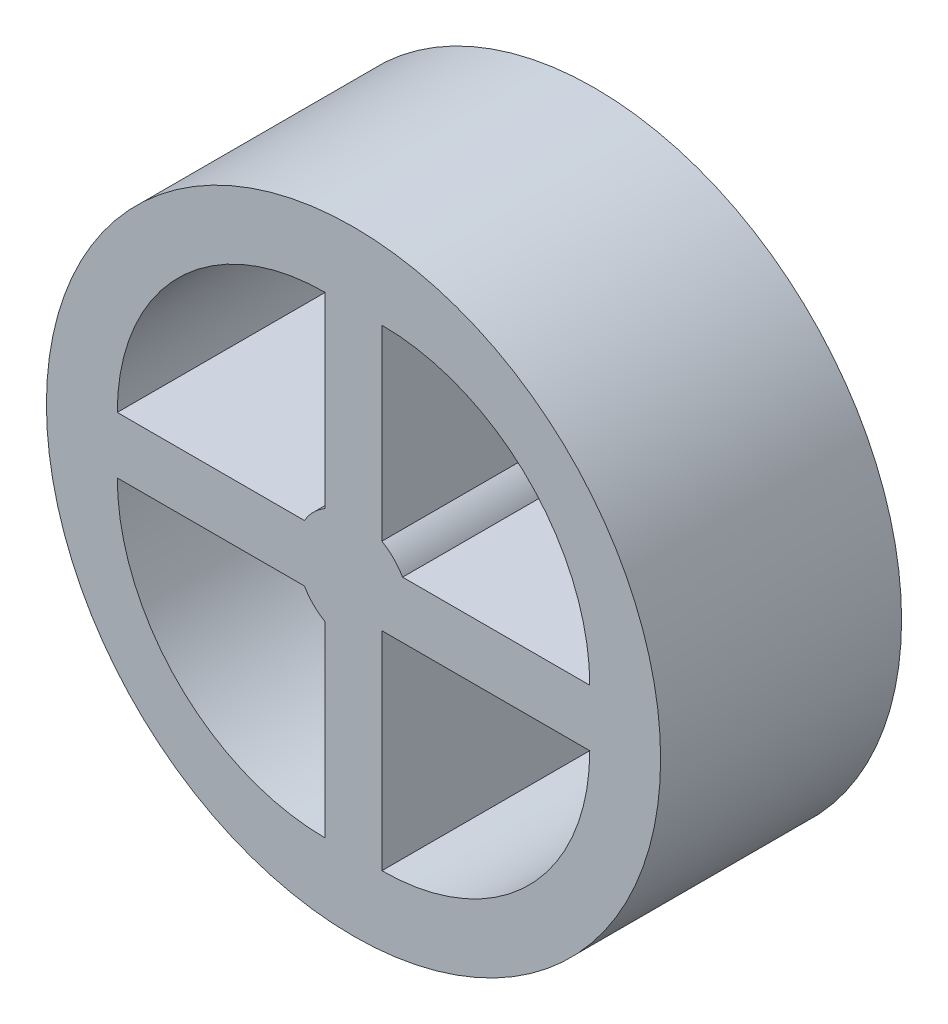
ISO-10303-21;
HEADER;
FILE_DESCRIPTION(('STEP AP214'),'2;1');
FILE_NAME('part.step','',(''),(''),'','','');
FILE_SCHEMA(('AUTOMOTIVE_DESIGN { 1 0 10303 214 1 1 1 1 }'));
ENDSEC;
DATA;
#1=APPLICATION_CONTEXT('core data for automotive mechanical design processes');
#2=APPLICATION_PROTOCOL_DEFINITION('international standard','automotive_design',2000,#1);
#3=PRODUCT_CONTEXT('',#1,'mechanical');
#4=PRODUCT('Part','Part','',(#3));
#5=PRODUCT_RELATED_PRODUCT_CATEGORY('part','',(#4));
#6=PRODUCT_DEFINITION_FORMATION('','',#4);
#7=PRODUCT_DEFINITION_CONTEXT('part definition',#1,'design');
#8=PRODUCT_DEFINITION('design','',#6,#7);
#9=PRODUCT_DEFINITION_SHAPE('','',#8);
#10=(LENGTH_UNIT() NAMED_UNIT(*) SI_UNIT(.MILLI.,.METRE.));
#11=(NAMED_UNIT(*) PLANE_ANGLE_UNIT() SI_UNIT($,.RADIAN.));
#12=(NAMED_UNIT(*) SI_UNIT($,.STERADIAN.) SOLID_ANGLE_UNIT());
#13=UNCERTAINTY_MEASURE_WITH_UNIT(LENGTH_MEASURE(1.E-05),#10,'distance_accuracy_value','');
#14=(GEOMETRIC_REPRESENTATION_CONTEXT(3) GLOBAL_UNCERTAINTY_ASSIGNED_CONTEXT((#13)) GLOBAL_UNIT_ASSIGNED_CONTEXT((#10,
#11,#12)) REPRESENTATION_CONTEXT('',''));
#15=CARTESIAN_POINT('',(0.,0.,0.));
#16=DIRECTION('',(0.,0.,1.));
#17=DIRECTION('',(1.,0.,0.));
#18=AXIS2_PLACEMENT_3D('',#15,#16,#17);
#19=CARTESIAN_POINT('',(0.,0.,255.));
#20=DIRECTION('',(0.,0.,1.));
#21=DIRECTION('',(1.,0.,0.));
#22=AXIS2_PLACEMENT_3D('',#19,#20,#21);
#23=PLANE('',#22);
#24=DIRECTION('',(0.,-1.,0.));
#25=VECTOR('',#24,1.);
#26=CARTESIAN_POINT('',(30.0000000000006,-30.0000000000006,255.));
#27=LINE('',#26,#25);
#28=CARTESIAN_POINT('',(30.0000000000006,-30.0000000000006,255.));
#29=VERTEX_POINT('',#28);
#30=CARTESIAN_POINT('',(30.,-250.,255.));
#31=VERTEX_POINT('',#30);
#32=EDGE_CURVE('E148',#29,#31,#27,.T.);
#33=ORIENTED_EDGE('',*,*,#32,.F.);
#34=DIRECTION('',(-1.,0.,0.));
#35=VECTOR('',#34,1.);
#36=CARTESIAN_POINT('',(30.0000000000006,-30.0000000000006,255.));
#37=LINE('',#36,#35);
#38=CARTESIAN_POINT('',(250.,-30.0000000000005,255.));
#39=VERTEX_POINT('',#38);
#40=EDGE_CURVE('E140',#39,#29,#37,.T.);
#41=ORIENTED_EDGE('',*,*,#40,.F.);
#42=CARTESIAN_POINT('',(30.0000000000006,-30.0000000000006,255.));
#43=DIRECTION('',(0.,0.,1.));
#44=DIRECTION('',(-1.,0.,0.));
#45=AXIS2_PLACEMENT_3D('',#42,#43,#44);
#46=CIRCLE('',#45,219.999999999999);
#47=EDGE_CURVE('E158',#31,#39,#46,.T.);
#48=ORIENTED_EDGE('',*,*,#47,.F.);
#49=EDGE_LOOP('',(#33,#41,#48));
#50=FACE_BOUND('',#49,.T.);
#51=CARTESIAN_POINT('',(0.,0.,255.));
#52=DIRECTION('',(0.,0.,1.));
#53=DIRECTION('',(1.,0.,0.));
#54=AXIS2_PLACEMENT_3D('',#51,#52,#53);
#55=CIRCLE('',#54,325.);
#56=CARTESIAN_POINT('',(325.,0.,255.));
#57=VERTEX_POINT('',#56);
#58=EDGE_CURVE('E11',#57,#57,#55,.T.);
#59=ORIENTED_EDGE('',*,*,#58,.T.);
#60=EDGE_LOOP('',(#59));
#61=FACE_BOUND('',#60,.T.);
#62=DIRECTION('',(0.,-1.,0.));
#63=VECTOR('',#62,1.);
#64=CARTESIAN_POINT('',(30.,250.,255.));
#65=LINE('',#64,#63);
#66=CARTESIAN_POINT('',(30.,250.,255.));
#67=VERTEX_POINT('',#66);
#68=CARTESIAN_POINT('',(30.,51.9615242270663,255.));
#69=VERTEX_POINT('',#68);
#70=EDGE_CURVE('E232',#67,#69,#65,.T.);
#71=ORIENTED_EDGE('',*,*,#70,.F.);
#72=CARTESIAN_POINT('',(30.,30.,255.));
#73=DIRECTION('',(0.,0.,1.));
#74=DIRECTION('',(-1.,0.,0.));
#75=AXIS2_PLACEMENT_3D('',#72,#73,#74);
#76=CIRCLE('',#75,220.);
#77=CARTESIAN_POINT('',(250.,30.,255.));
#78=VERTEX_POINT('',#77);
#79=EDGE_CURVE('E230',#78,#67,#76,.T.);
#80=ORIENTED_EDGE('',*,*,#79,.F.);
#81=DIRECTION('',(1.,0.,0.));
#82=VECTOR('',#81,1.);
#83=CARTESIAN_POINT('',(51.9615242270663,30.,255.));
#84=LINE('',#83,#82);
#85=CARTESIAN_POINT('',(51.9615242270663,30.,255.));
#86=VERTEX_POINT('',#85);
#87=EDGE_CURVE('E238',#86,#78,#84,.T.);
#88=ORIENTED_EDGE('',*,*,#87,.F.);
#89=CARTESIAN_POINT('',(0.,0.,255.));
#90=DIRECTION('',(0.,0.,-1.));
#91=DIRECTION('',(1.,0.,0.));
#92=AXIS2_PLACEMENT_3D('',#89,#90,#91);
#93=CIRCLE('',#92,60.);
#94=EDGE_CURVE('E235',#69,#86,#93,.T.);
#95=ORIENTED_EDGE('',*,*,#94,.F.);
#96=EDGE_LOOP('',(#71,#80,#88,#95));
#97=FACE_BOUND('',#96,.T.);
#98=DIRECTION('',(0.,1.,0.));
#99=VECTOR('',#98,1.);
#100=CARTESIAN_POINT('',(-30.,250.,255.));
#101=LINE('',#100,#99);
#102=CARTESIAN_POINT('',(-30.,51.9615242270663,255.));
#103=VERTEX_POINT('',#102);
#104=CARTESIAN_POINT('',(-30.,250.,255.));
#105=VERTEX_POINT('',#104);
#106=EDGE_CURVE('E201',#103,#105,#101,.T.);
#107=ORIENTED_EDGE('',*,*,#106,.F.);
#108=CARTESIAN_POINT('',(0.,0.,255.));
#109=DIRECTION('',(0.,0.,-1.));
#110=DIRECTION('',(1.,0.,0.));
#111=AXIS2_PLACEMENT_3D('',#108,#109,#110);
#112=CIRCLE('',#111,60.);
#113=CARTESIAN_POINT('',(-51.9615242270663,30.,255.));
#114=VERTEX_POINT('',#113);
#115=EDGE_CURVE('E199',#114,#103,#112,.T.);
#116=ORIENTED_EDGE('',*,*,#115,.F.);
#117=DIRECTION('',(1.,0.,0.));
#118=VECTOR('',#117,1.);
#119=CARTESIAN_POINT('',(-51.9615242270663,30.,255.));
#120=LINE('',#119,#118);
#121=CARTESIAN_POINT('',(-250.,30.,255.));
#122=VERTEX_POINT('',#121);
#123=EDGE_CURVE('E207',#122,#114,#120,.T.);
#124=ORIENTED_EDGE('',*,*,#123,.F.);
#125=CARTESIAN_POINT('',(-30.,30.,255.));
#126=DIRECTION('',(0.,0.,1.));
#127=DIRECTION('',(1.,0.,0.));
#128=AXIS2_PLACEMENT_3D('',#125,#126,#127);
#129=CIRCLE('',#128,220.);
#130=EDGE_CURVE('E204',#105,#122,#129,.T.);
#131=ORIENTED_EDGE('',*,*,#130,.F.);
#132=EDGE_LOOP('',(#107,#116,#124,#131));
#133=FACE_BOUND('',#132,.T.);
#134=DIRECTION('',(0.,1.,0.));
#135=VECTOR('',#134,1.);
#136=CARTESIAN_POINT('',(-30.,-51.9615242270663,255.));
#137=LINE('',#136,#135);
#138=CARTESIAN_POINT('',(-30.,-250.,255.));
#139=VERTEX_POINT('',#138);
#140=CARTESIAN_POINT('',(-30.,-51.9615242270663,255.));
#141=VERTEX_POINT('',#140);
#142=EDGE_CURVE('E170',#139,#141,#137,.T.);
#143=ORIENTED_EDGE('',*,*,#142,.F.);
#144=CARTESIAN_POINT('',(-30.,-30.,255.));
#145=DIRECTION('',(0.,0.,1.));
#146=DIRECTION('',(1.,0.,0.));
#147=AXIS2_PLACEMENT_3D('',#144,#145,#146);
#148=CIRCLE('',#147,220.);
#149=CARTESIAN_POINT('',(-250.,-30.,255.));
#150=VERTEX_POINT('',#149);
#151=EDGE_CURVE('E168',#150,#139,#148,.T.);
#152=ORIENTED_EDGE('',*,*,#151,.F.);
#153=DIRECTION('',(-1.,0.,0.));
#154=VECTOR('',#153,1.);
#155=CARTESIAN_POINT('',(-51.9615242270663,-30.,255.));
#156=LINE('',#155,#154);
#157=CARTESIAN_POINT('',(-51.9615242270663,-30.,255.));
#158=VERTEX_POINT('',#157);
#159=EDGE_CURVE('E176',#158,#150,#156,.T.);
#160=ORIENTED_EDGE('',*,*,#159,.F.);
#161=CARTESIAN_POINT('',(0.,0.,255.));
#162=DIRECTION('',(0.,0.,-1.));
#163=DIRECTION('',(1.,0.,0.));
#164=AXIS2_PLACEMENT_3D('',#161,#162,#163);
#165=CIRCLE('',#164,60.);
#166=EDGE_CURVE('E173',#141,#158,#165,.T.);
#167=ORIENTED_EDGE('',*,*,#166,.F.);
#168=EDGE_LOOP('',(#143,#152,#160,#167));
#169=FACE_BOUND('',#168,.T.);
#170=ADVANCED_FACE('F33',(#50,#61,#97,#133,#169),#23,.T.);
#171=CARTESIAN_POINT('',(0.,0.,0.));
#172=DIRECTION('',(0.,0.,1.));
#173=DIRECTION('',(1.,0.,0.));
#174=AXIS2_PLACEMENT_3D('',#171,#172,#173);
#175=PLANE('',#174);
#176=DIRECTION('',(-1.,0.,0.));
#177=VECTOR('',#176,1.);
#178=CARTESIAN_POINT('',(30.0000000000006,-30.0000000000006,0.));
#179=LINE('',#178,#177);
#180=CARTESIAN_POINT('',(250.,-30.0000000000006,0.));
#181=VERTEX_POINT('',#180);
#182=CARTESIAN_POINT('',(30.0000000000006,-30.0000000000006,0.));
#183=VERTEX_POINT('',#182);
#184=EDGE_CURVE('E56',#181,#183,#179,.T.);
#185=ORIENTED_EDGE('',*,*,#184,.T.);
#186=DIRECTION('',(0.,-1.,0.));
#187=VECTOR('',#186,1.);
#188=CARTESIAN_POINT('',(30.0000000000006,-30.0000000000006,0.));
#189=LINE('',#188,#187);
#190=CARTESIAN_POINT('',(30.,-250.,0.));
#191=VERTEX_POINT('',#190);
#192=EDGE_CURVE('E154',#183,#191,#189,.T.);
#193=ORIENTED_EDGE('',*,*,#192,.T.);
#194=CARTESIAN_POINT('',(30.0000000000006,-30.0000000000006,0.));
#195=DIRECTION('',(0.,0.,1.));
#196=DIRECTION('',(-1.,0.,0.));
#197=AXIS2_PLACEMENT_3D('',#194,#195,#196);
#198=CIRCLE('',#197,219.999999999999);
#199=EDGE_CURVE('E149',#191,#181,#198,.T.);
#200=ORIENTED_EDGE('',*,*,#199,.T.);
#201=EDGE_LOOP('',(#185,#193,#200));
#202=FACE_BOUND('',#201,.T.);
#203=CARTESIAN_POINT('',(0.,0.,0.));
#204=DIRECTION('',(0.,0.,-1.));
#205=DIRECTION('',(1.,0.,0.));
#206=AXIS2_PLACEMENT_3D('',#203,#204,#205);
#207=CIRCLE('',#206,60.);
#208=CARTESIAN_POINT('',(-51.9615242270663,30.,0.));
#209=VERTEX_POINT('',#208);
#210=CARTESIAN_POINT('',(-30.,51.9615242270663,0.));
#211=VERTEX_POINT('',#210);
#212=EDGE_CURVE('E198',#209,#211,#207,.T.);
#213=ORIENTED_EDGE('',*,*,#212,.T.);
#214=DIRECTION('',(0.,1.,0.));
#215=VECTOR('',#214,1.);
#216=CARTESIAN_POINT('',(-30.,250.,0.));
#217=LINE('',#216,#215);
#218=CARTESIAN_POINT('',(-30.,250.,0.));
#219=VERTEX_POINT('',#218);
#220=EDGE_CURVE('E212',#211,#219,#217,.T.);
#221=ORIENTED_EDGE('',*,*,#220,.T.);
#222=CARTESIAN_POINT('',(-30.,30.,0.));
#223=DIRECTION('',(0.,0.,1.));
#224=DIRECTION('',(1.,0.,0.));
#225=AXIS2_PLACEMENT_3D('',#222,#223,#224);
#226=CIRCLE('',#225,220.);
#227=CARTESIAN_POINT('',(-250.,30.,0.));
#228=VERTEX_POINT('',#227);
#229=EDGE_CURVE('E215',#219,#228,#226,.T.);
#230=ORIENTED_EDGE('',*,*,#229,.T.);
#231=DIRECTION('',(1.,0.,0.));
#232=VECTOR('',#231,1.);
#233=CARTESIAN_POINT('',(-51.9615242270663,30.,0.));
#234=LINE('',#233,#232);
#235=EDGE_CURVE('E202',#228,#209,#234,.T.);
#236=ORIENTED_EDGE('',*,*,#235,.T.);
#237=EDGE_LOOP('',(#213,#221,#230,#236));
#238=FACE_BOUND('',#237,.T.);
#239=CARTESIAN_POINT('',(0.,0.,0.));
#240=DIRECTION('',(0.,0.,1.));
#241=DIRECTION('',(1.,0.,0.));
#242=AXIS2_PLACEMENT_3D('',#239,#240,#241);
#243=CIRCLE('',#242,325.);
#244=CARTESIAN_POINT('',(325.,0.,0.));
#245=VERTEX_POINT('',#244);
#246=EDGE_CURVE('E37',#245,#245,#243,.T.);
#247=ORIENTED_EDGE('',*,*,#246,.F.);
#248=EDGE_LOOP('',(#247));
#249=FACE_BOUND('',#248,.T.);
#250=CARTESIAN_POINT('',(30.,30.,0.));
#251=DIRECTION('',(0.,0.,1.));
#252=DIRECTION('',(-1.,0.,0.));
#253=AXIS2_PLACEMENT_3D('',#250,#251,#252);
#254=CIRCLE('',#253,220.);
#255=CARTESIAN_POINT('',(250.,30.,0.));
#256=VERTEX_POINT('',#255);
#257=CARTESIAN_POINT('',(30.,250.,0.));
#258=VERTEX_POINT('',#257);
#259=EDGE_CURVE('E229',#256,#258,#254,.T.);
#260=ORIENTED_EDGE('',*,*,#259,.T.);
#261=DIRECTION('',(0.,-1.,0.));
#262=VECTOR('',#261,1.);
#263=CARTESIAN_POINT('',(30.,250.,0.));
#264=LINE('',#263,#262);
#265=CARTESIAN_POINT('',(30.,51.9615242270663,0.));
#266=VERTEX_POINT('',#265);
#267=EDGE_CURVE('E243',#258,#266,#264,.T.);
#268=ORIENTED_EDGE('',*,*,#267,.T.);
#269=CARTESIAN_POINT('',(0.,0.,0.));
#270=DIRECTION('',(0.,0.,-1.));
#271=DIRECTION('',(1.,0.,0.));
#272=AXIS2_PLACEMENT_3D('',#269,#270,#271);
#273=CIRCLE('',#272,60.);
#274=CARTESIAN_POINT('',(51.9615242270663,30.,0.));
#275=VERTEX_POINT('',#274);
#276=EDGE_CURVE('E246',#266,#275,#273,.T.);
#277=ORIENTED_EDGE('',*,*,#276,.T.);
#278=DIRECTION('',(1.,0.,0.));
#279=VECTOR('',#278,1.);
#280=CARTESIAN_POINT('',(51.9615242270663,30.,0.));
#281=LINE('',#280,#279);
#282=EDGE_CURVE('E233',#275,#256,#281,.T.);
#283=ORIENTED_EDGE('',*,*,#282,.T.);
#284=EDGE_LOOP('',(#260,#268,#277,#283));
#285=FACE_BOUND('',#284,.T.);
#286=CARTESIAN_POINT('',(-30.,-30.,0.));
#287=DIRECTION('',(0.,0.,1.));
#288=DIRECTION('',(1.,0.,0.));
#289=AXIS2_PLACEMENT_3D('',#286,#287,#288);
#290=CIRCLE('',#289,220.);
#291=CARTESIAN_POINT('',(-250.,-30.,0.));
#292=VERTEX_POINT('',#291);
#293=CARTESIAN_POINT('',(-30.,-250.,0.));
#294=VERTEX_POINT('',#293);
#295=EDGE_CURVE('E155',#292,#294,#290,.T.);
#296=ORIENTED_EDGE('',*,*,#295,.T.);
#297=DIRECTION('',(0.,1.,0.));
#298=VECTOR('',#297,1.);
#299=CARTESIAN_POINT('',(-30.,-51.9615242270663,0.));
#300=LINE('',#299,#298);
#301=CARTESIAN_POINT('',(-30.,-51.9615242270663,0.));
#302=VERTEX_POINT('',#301);
#303=EDGE_CURVE('E181',#294,#302,#300,.T.);
#304=ORIENTED_EDGE('',*,*,#303,.T.);
#305=CARTESIAN_POINT('',(0.,0.,0.));
#306=DIRECTION('',(0.,0.,-1.));
#307=DIRECTION('',(1.,0.,0.));
#308=AXIS2_PLACEMENT_3D('',#305,#306,#307);
#309=CIRCLE('',#308,60.);
#310=CARTESIAN_POINT('',(-51.9615242270663,-30.,0.));
#311=VERTEX_POINT('',#310);
#312=EDGE_CURVE('E184',#302,#311,#309,.T.);
#313=ORIENTED_EDGE('',*,*,#312,.T.);
#314=DIRECTION('',(-1.,0.,0.));
#315=VECTOR('',#314,1.);
#316=CARTESIAN_POINT('',(-51.9615242270663,-30.,0.));
#317=LINE('',#316,#315);
#318=EDGE_CURVE('E171',#311,#292,#317,.T.);
#319=ORIENTED_EDGE('',*,*,#318,.T.);
#320=EDGE_LOOP('',(#296,#304,#313,#319));
#321=FACE_BOUND('',#320,.T.);
#322=ADVANCED_FACE('F265',(#202,#238,#249,#285,#321),#175,.F.);
#323=CARTESIAN_POINT('',(0.,0.,255.));
#324=DIRECTION('',(0.,0.,-1.));
#325=DIRECTION('',(-1.,0.,0.));
#326=AXIS2_PLACEMENT_3D('',#323,#324,#325);
#327=CYLINDRICAL_SURFACE('',#326,325.);
#328=ORIENTED_EDGE('',*,*,#58,.F.);
#329=EDGE_LOOP('',(#328));
#330=FACE_BOUND('',#329,.T.);
#331=ORIENTED_EDGE('',*,*,#246,.T.);
#332=EDGE_LOOP('',(#331));
#333=FACE_BOUND('',#332,.T.);
#334=ADVANCED_FACE('F35',(#330,#333),#327,.T.);
#335=CARTESIAN_POINT('',(30.,30.,255.));
#336=DIRECTION('',(0.,0.,-1.));
#337=DIRECTION('',(-1.,0.,0.));
#338=AXIS2_PLACEMENT_3D('',#335,#336,#337);
#339=CYLINDRICAL_SURFACE('',#338,220.);
#340=ORIENTED_EDGE('',*,*,#259,.F.);
#341=DIRECTION('',(0.,0.,-1.));
#342=VECTOR('',#341,1.);
#343=CARTESIAN_POINT('',(250.,30.,255.));
#344=LINE('',#343,#342);
#345=EDGE_CURVE('E240',#78,#256,#344,.T.);
#346=ORIENTED_EDGE('',*,*,#345,.F.);
#347=ORIENTED_EDGE('',*,*,#79,.T.);
#348=DIRECTION('',(0.,0.,-1.));
#349=VECTOR('',#348,1.);
#350=CARTESIAN_POINT('',(30.,250.,255.));
#351=LINE('',#350,#349);
#352=EDGE_CURVE('E257',#67,#258,#351,.T.);
#353=ORIENTED_EDGE('',*,*,#352,.T.);
#354=EDGE_LOOP('',(#340,#346,#347,#353));
#355=FACE_BOUND('',#354,.T.);
#356=ADVANCED_FACE('F301',(#355),#339,.F.);
#357=CARTESIAN_POINT('',(30.,250.,255.));
#358=DIRECTION('',(1.,0.,0.));
#359=DIRECTION('',(0.,1.,0.));
#360=AXIS2_PLACEMENT_3D('',#357,#358,#359);
#361=PLANE('',#360);
#362=ORIENTED_EDGE('',*,*,#267,.F.);
#363=ORIENTED_EDGE('',*,*,#352,.F.);
#364=ORIENTED_EDGE('',*,*,#70,.T.);
#365=DIRECTION('',(0.,0.,-1.));
#366=VECTOR('',#365,1.);
#367=CARTESIAN_POINT('',(30.,51.9615242270663,255.));
#368=LINE('',#367,#366);
#369=EDGE_CURVE('E255',#69,#266,#368,.T.);
#370=ORIENTED_EDGE('',*,*,#369,.T.);
#371=EDGE_LOOP('',(#362,#363,#364,#370));
#372=FACE_BOUND('',#371,.T.);
#373=ADVANCED_FACE('F304',(#372),#361,.T.);
#374=CARTESIAN_POINT('',(0.,0.,255.));
#375=DIRECTION('',(0.,0.,-1.));
#376=DIRECTION('',(-1.,0.,0.));
#377=AXIS2_PLACEMENT_3D('',#374,#375,#376);
#378=CYLINDRICAL_SURFACE('',#377,60.);
#379=ORIENTED_EDGE('',*,*,#276,.F.);
#380=ORIENTED_EDGE('',*,*,#369,.F.);
#381=ORIENTED_EDGE('',*,*,#94,.T.);
#382=DIRECTION('',(0.,0.,-1.));
#383=VECTOR('',#382,1.);
#384=CARTESIAN_POINT('',(51.9615242270663,30.,255.));
#385=LINE('',#384,#383);
#386=EDGE_CURVE('E253',#86,#275,#385,.T.);
#387=ORIENTED_EDGE('',*,*,#386,.T.);
#388=EDGE_LOOP('',(#379,#380,#381,#387));
#389=FACE_BOUND('',#388,.T.);
#390=ADVANCED_FACE('F307',(#389),#378,.T.);
#391=CARTESIAN_POINT('',(51.9615242270663,30.,255.));
#392=DIRECTION('',(0.,1.,0.));
#393=DIRECTION('',(-1.,0.,0.));
#394=AXIS2_PLACEMENT_3D('',#391,#392,#393);
#395=PLANE('',#394);
#396=ORIENTED_EDGE('',*,*,#282,.F.);
#397=ORIENTED_EDGE('',*,*,#386,.F.);
#398=ORIENTED_EDGE('',*,*,#87,.T.);
#399=ORIENTED_EDGE('',*,*,#345,.T.);
#400=EDGE_LOOP('',(#396,#397,#398,#399));
#401=FACE_BOUND('',#400,.T.);
#402=ADVANCED_FACE('F311',(#401),#395,.T.);
#403=CARTESIAN_POINT('',(0.,0.,255.));
#404=DIRECTION('',(0.,0.,-1.));
#405=DIRECTION('',(-1.,0.,0.));
#406=AXIS2_PLACEMENT_3D('',#403,#404,#405);
#407=CYLINDRICAL_SURFACE('',#406,60.);
#408=ORIENTED_EDGE('',*,*,#212,.F.);
#409=DIRECTION('',(0.,0.,-1.));
#410=VECTOR('',#409,1.);
#411=CARTESIAN_POINT('',(-51.9615242270663,30.,255.));
#412=LINE('',#411,#410);
#413=EDGE_CURVE('E209',#114,#209,#412,.T.);
#414=ORIENTED_EDGE('',*,*,#413,.F.);
#415=ORIENTED_EDGE('',*,*,#115,.T.);
#416=DIRECTION('',(0.,0.,-1.));
#417=VECTOR('',#416,1.);
#418=CARTESIAN_POINT('',(-30.,51.9615242270663,255.));
#419=LINE('',#418,#417);
#420=EDGE_CURVE('E226',#103,#211,#419,.T.);
#421=ORIENTED_EDGE('',*,*,#420,.T.);
#422=EDGE_LOOP('',(#408,#414,#415,#421));
#423=FACE_BOUND('',#422,.T.);
#424=ADVANCED_FACE('F315',(#423),#407,.T.);
#425=CARTESIAN_POINT('',(-30.,250.,255.));
#426=DIRECTION('',(-1.,0.,0.));
#427=DIRECTION('',(0.,-1.,0.));
#428=AXIS2_PLACEMENT_3D('',#425,#426,#427);
#429=PLANE('',#428);
#430=ORIENTED_EDGE('',*,*,#220,.F.);
#431=ORIENTED_EDGE('',*,*,#420,.F.);
#432=ORIENTED_EDGE('',*,*,#106,.T.);
#433=DIRECTION('',(0.,0.,-1.));
#434=VECTOR('',#433,1.);
#435=CARTESIAN_POINT('',(-30.,250.,255.));
#436=LINE('',#435,#434);
#437=EDGE_CURVE('E224',#105,#219,#436,.T.);
#438=ORIENTED_EDGE('',*,*,#437,.T.);
#439=EDGE_LOOP('',(#430,#431,#432,#438));
#440=FACE_BOUND('',#439,.T.);
#441=ADVANCED_FACE('F319',(#440),#429,.T.);
#442=CARTESIAN_POINT('',(-30.,30.,255.));
#443=DIRECTION('',(0.,0.,-1.));
#444=DIRECTION('',(-1.,0.,0.));
#445=AXIS2_PLACEMENT_3D('',#442,#443,#444);
#446=CYLINDRICAL_SURFACE('',#445,220.);
#447=ORIENTED_EDGE('',*,*,#229,.F.);
#448=ORIENTED_EDGE('',*,*,#437,.F.);
#449=ORIENTED_EDGE('',*,*,#130,.T.);
#450=DIRECTION('',(0.,0.,-1.));
#451=VECTOR('',#450,1.);
#452=CARTESIAN_POINT('',(-250.,30.,255.));
#453=LINE('',#452,#451);
#454=EDGE_CURVE('E222',#122,#228,#453,.T.);
#455=ORIENTED_EDGE('',*,*,#454,.T.);
#456=EDGE_LOOP('',(#447,#448,#449,#455));
#457=FACE_BOUND('',#456,.T.);
#458=ADVANCED_FACE('F323',(#457),#446,.F.);
#459=CARTESIAN_POINT('',(-51.9615242270663,30.,255.));
#460=DIRECTION('',(0.,1.,0.));
#461=DIRECTION('',(-1.,0.,0.));
#462=AXIS2_PLACEMENT_3D('',#459,#460,#461);
#463=PLANE('',#462);
#464=ORIENTED_EDGE('',*,*,#235,.F.);
#465=ORIENTED_EDGE('',*,*,#454,.F.);
#466=ORIENTED_EDGE('',*,*,#123,.T.);
#467=ORIENTED_EDGE('',*,*,#413,.T.);
#468=EDGE_LOOP('',(#464,#465,#466,#467));
#469=FACE_BOUND('',#468,.T.);
#470=ADVANCED_FACE('F327',(#469),#463,.T.);
#471=CARTESIAN_POINT('',(-30.,-30.,255.));
#472=DIRECTION('',(0.,0.,-1.));
#473=DIRECTION('',(-1.,0.,0.));
#474=AXIS2_PLACEMENT_3D('',#471,#472,#473);
#475=CYLINDRICAL_SURFACE('',#474,220.);
#476=ORIENTED_EDGE('',*,*,#295,.F.);
#477=DIRECTION('',(0.,0.,-1.));
#478=VECTOR('',#477,1.);
#479=CARTESIAN_POINT('',(-250.,-30.,255.));
#480=LINE('',#479,#478);
#481=EDGE_CURVE('E178',#150,#292,#480,.T.);
#482=ORIENTED_EDGE('',*,*,#481,.F.);
#483=ORIENTED_EDGE('',*,*,#151,.T.);
#484=DIRECTION('',(0.,0.,-1.));
#485=VECTOR('',#484,1.);
#486=CARTESIAN_POINT('',(-30.,-250.,255.));
#487=LINE('',#486,#485);
#488=EDGE_CURVE('E195',#139,#294,#487,.T.);
#489=ORIENTED_EDGE('',*,*,#488,.T.);
#490=EDGE_LOOP('',(#476,#482,#483,#489));
#491=FACE_BOUND('',#490,.T.);
#492=ADVANCED_FACE('F273',(#491),#475,.F.);
#493=CARTESIAN_POINT('',(-30.,-51.9615242270663,255.));
#494=DIRECTION('',(-1.,0.,0.));
#495=DIRECTION('',(0.,-1.,0.));
#496=AXIS2_PLACEMENT_3D('',#493,#494,#495);
#497=PLANE('',#496);
#498=ORIENTED_EDGE('',*,*,#303,.F.);
#499=ORIENTED_EDGE('',*,*,#488,.F.);
#500=ORIENTED_EDGE('',*,*,#142,.T.);
#501=DIRECTION('',(0.,0.,-1.));
#502=VECTOR('',#501,1.);
#503=CARTESIAN_POINT('',(-30.,-51.9615242270663,255.));
#504=LINE('',#503,#502);
#505=EDGE_CURVE('E193',#141,#302,#504,.T.);
#506=ORIENTED_EDGE('',*,*,#505,.T.);
#507=EDGE_LOOP('',(#498,#499,#500,#506));
#508=FACE_BOUND('',#507,.T.);
#509=ADVANCED_FACE('F283',(#508),#497,.T.);
#510=CARTESIAN_POINT('',(0.,0.,255.));
#511=DIRECTION('',(0.,0.,-1.));
#512=DIRECTION('',(-1.,0.,0.));
#513=AXIS2_PLACEMENT_3D('',#510,#511,#512);
#514=CYLINDRICAL_SURFACE('',#513,60.);
#515=ORIENTED_EDGE('',*,*,#312,.F.);
#516=ORIENTED_EDGE('',*,*,#505,.F.);
#517=ORIENTED_EDGE('',*,*,#166,.T.);
#518=DIRECTION('',(0.,0.,-1.));
#519=VECTOR('',#518,1.);
#520=CARTESIAN_POINT('',(-51.9615242270663,-30.,255.));
#521=LINE('',#520,#519);
#522=EDGE_CURVE('E191',#158,#311,#521,.T.);
#523=ORIENTED_EDGE('',*,*,#522,.T.);
#524=EDGE_LOOP('',(#515,#516,#517,#523));
#525=FACE_BOUND('',#524,.T.);
#526=ADVANCED_FACE('F287',(#525),#514,.T.);
#527=CARTESIAN_POINT('',(-51.9615242270663,-30.,255.));
#528=DIRECTION('',(0.,-1.,0.));
#529=DIRECTION('',(1.,0.,0.));
#530=AXIS2_PLACEMENT_3D('',#527,#528,#529);
#531=PLANE('',#530);
#532=ORIENTED_EDGE('',*,*,#318,.F.);
#533=ORIENTED_EDGE('',*,*,#522,.F.);
#534=ORIENTED_EDGE('',*,*,#159,.T.);
#535=ORIENTED_EDGE('',*,*,#481,.T.);
#536=EDGE_LOOP('',(#532,#533,#534,#535));
#537=FACE_BOUND('',#536,.T.);
#538=ADVANCED_FACE('F277',(#537),#531,.T.);
#539=CARTESIAN_POINT('',(30.0000000000006,-30.0000000000006,255.));
#540=DIRECTION('',(0.,-1.,0.));
#541=DIRECTION('',(0.,0.,-1.));
#542=AXIS2_PLACEMENT_3D('',#539,#540,#541);
#543=PLANE('',#542);
#544=ORIENTED_EDGE('',*,*,#184,.F.);
#545=DIRECTION('',(0.,0.,-1.));
#546=VECTOR('',#545,1.);
#547=CARTESIAN_POINT('',(250.,-30.0000000000005,255.));
#548=LINE('',#547,#546);
#549=EDGE_CURVE('E144',#39,#181,#548,.T.);
#550=ORIENTED_EDGE('',*,*,#549,.F.);
#551=ORIENTED_EDGE('',*,*,#40,.T.);
#552=DIRECTION('',(0.,0.,-1.));
#553=VECTOR('',#552,1.);
#554=CARTESIAN_POINT('',(30.0000000000006,-30.0000000000006,255.));
#555=LINE('',#554,#553);
#556=EDGE_CURVE('E143',#29,#183,#555,.T.);
#557=ORIENTED_EDGE('',*,*,#556,.T.);
#558=EDGE_LOOP('',(#544,#550,#551,#557));
#559=FACE_BOUND('',#558,.T.);
#560=ADVANCED_FACE('F142',(#559),#543,.T.);
#561=CARTESIAN_POINT('',(30.0000000000006,-30.0000000000006,255.));
#562=DIRECTION('',(1.,0.,0.));
#563=DIRECTION('',(0.,1.,0.));
#564=AXIS2_PLACEMENT_3D('',#561,#562,#563);
#565=PLANE('',#564);
#566=ORIENTED_EDGE('',*,*,#192,.F.);
#567=ORIENTED_EDGE('',*,*,#556,.F.);
#568=ORIENTED_EDGE('',*,*,#32,.T.);
#569=DIRECTION('',(0.,0.,-1.));
#570=VECTOR('',#569,1.);
#571=CARTESIAN_POINT('',(30.,-250.,255.));
#572=LINE('',#571,#570);
#573=EDGE_CURVE('E48',#31,#191,#572,.T.);
#574=ORIENTED_EDGE('',*,*,#573,.T.);
#575=EDGE_LOOP('',(#566,#567,#568,#574));
#576=FACE_BOUND('',#575,.T.);
#577=ADVANCED_FACE('F152',(#576),#565,.T.);
#578=CARTESIAN_POINT('',(30.0000000000006,-30.0000000000006,255.));
#579=DIRECTION('',(0.,0.,-1.));
#580=DIRECTION('',(-1.,0.,0.));
#581=AXIS2_PLACEMENT_3D('',#578,#579,#580);
#582=CYLINDRICAL_SURFACE('',#581,219.999999999999);
#583=ORIENTED_EDGE('',*,*,#199,.F.);
#584=ORIENTED_EDGE('',*,*,#573,.F.);
#585=ORIENTED_EDGE('',*,*,#47,.T.);
#586=ORIENTED_EDGE('',*,*,#549,.T.);
#587=EDGE_LOOP('',(#583,#584,#585,#586));
#588=FACE_BOUND('',#587,.T.);
#589=ADVANCED_FACE('F380',(#588),#582,.F.);
#590=CLOSED_SHELL('',(#170,#322,#334,#356,#373,#390,#402,#424,#441,#458,#470,#492,#509,#526,
#538,#560,#577,#589));
#591=MANIFOLD_SOLID_BREP('B2',#590);
#592=ADVANCED_BREP_SHAPE_REPRESENTATION('',(#18,#591),#14);
#593=SHAPE_DEFINITION_REPRESENTATION(#9,#592);
ENDSEC;
END-ISO-10303-21;
